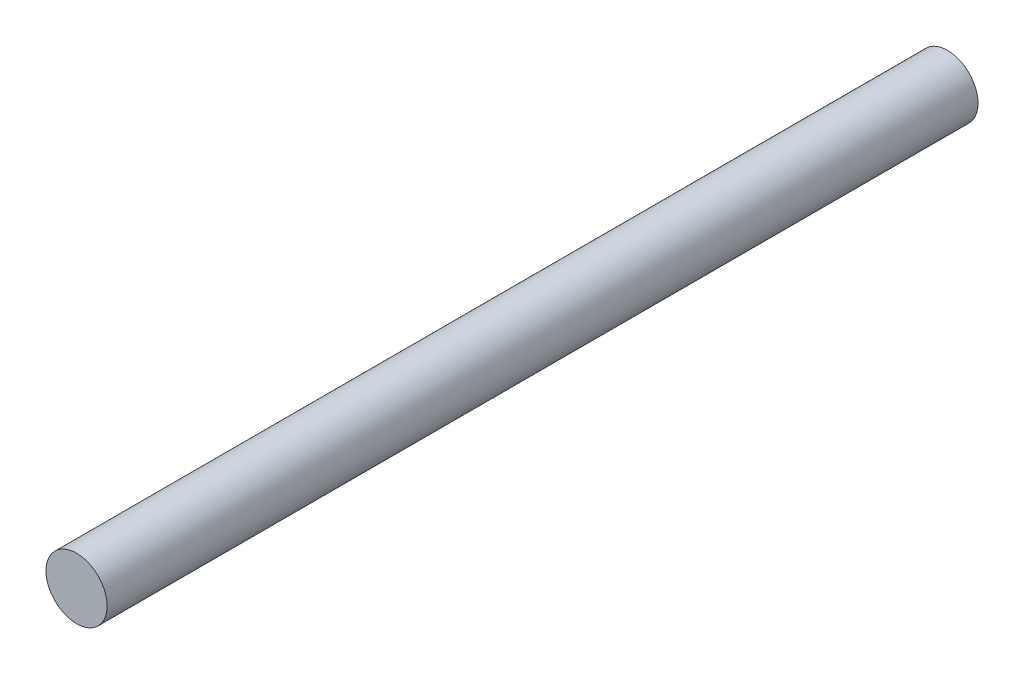
ISO-10303-21;
HEADER;
FILE_DESCRIPTION(('STEP AP214'),'2;1');
FILE_NAME('part.step','',(''),(''),'','','');
FILE_SCHEMA(('AUTOMOTIVE_DESIGN { 1 0 10303 214 1 1 1 1 }'));
ENDSEC;
DATA;
#1=APPLICATION_CONTEXT('core data for automotive mechanical design processes');
#2=APPLICATION_PROTOCOL_DEFINITION('international standard','automotive_design',2000,#1);
#3=PRODUCT_CONTEXT('',#1,'mechanical');
#4=PRODUCT('Part','Part','',(#3));
#5=PRODUCT_RELATED_PRODUCT_CATEGORY('part','',(#4));
#6=PRODUCT_DEFINITION_FORMATION('','',#4);
#7=PRODUCT_DEFINITION_CONTEXT('part definition',#1,'design');
#8=PRODUCT_DEFINITION('design','',#6,#7);
#9=PRODUCT_DEFINITION_SHAPE('','',#8);
#10=(LENGTH_UNIT() NAMED_UNIT(*) SI_UNIT(.MILLI.,.METRE.));
#11=(NAMED_UNIT(*) PLANE_ANGLE_UNIT() SI_UNIT($,.RADIAN.));
#12=(NAMED_UNIT(*) SI_UNIT($,.STERADIAN.) SOLID_ANGLE_UNIT());
#13=UNCERTAINTY_MEASURE_WITH_UNIT(LENGTH_MEASURE(1.E-05),#10,'distance_accuracy_value','');
#14=(GEOMETRIC_REPRESENTATION_CONTEXT(3) GLOBAL_UNCERTAINTY_ASSIGNED_CONTEXT((#13)) GLOBAL_UNIT_ASSIGNED_CONTEXT((#10,
#11,#12)) REPRESENTATION_CONTEXT('',''));
#15=CARTESIAN_POINT('',(0.,0.,0.));
#16=DIRECTION('',(0.,0.,1.));
#17=DIRECTION('',(1.,0.,0.));
#18=AXIS2_PLACEMENT_3D('',#15,#16,#17);
#19=CARTESIAN_POINT('',(0.,0.,114.));
#20=DIRECTION('',(0.,0.,-1.));
#21=DIRECTION('',(-1.,0.,0.));
#22=AXIS2_PLACEMENT_3D('',#19,#20,#21);
#23=CYLINDRICAL_SURFACE('',#22,4.);
#24=CARTESIAN_POINT('',(0.,0.,114.));
#25=DIRECTION('',(0.,0.,1.));
#26=DIRECTION('',(1.,0.,0.));
#27=AXIS2_PLACEMENT_3D('',#24,#25,#26);
#28=CIRCLE('',#27,4.);
#29=CARTESIAN_POINT('',(-4.,0.,114.));
#30=VERTEX_POINT('',#29);
#31=EDGE_CURVE('E10',#30,#30,#28,.T.);
#32=CARTESIAN_POINT('',(0.,0.,0.));
#33=DIRECTION('',(0.,0.,1.));
#34=DIRECTION('',(1.,0.,0.));
#35=AXIS2_PLACEMENT_3D('',#32,#33,#34);
#36=CIRCLE('',#35,4.);
#37=CARTESIAN_POINT('',(-4.,0.,0.));
#38=VERTEX_POINT('',#37);
#39=EDGE_CURVE('E33',#38,#38,#36,.T.);
#40=CARTESIAN_POINT('',(-4.,0.,114.));
#41=CARTESIAN_POINT('',(-4.,0.,112.8125));
#42=CARTESIAN_POINT('',(-4.,0.,111.625));
#43=CARTESIAN_POINT('',(-4.,0.,109.25));
#44=CARTESIAN_POINT('',(-4.,0.,108.0625));
#45=CARTESIAN_POINT('',(-4.,0.,105.6875));
#46=CARTESIAN_POINT('',(-4.,0.,104.5));
#47=CARTESIAN_POINT('',(-4.,0.,102.125));
#48=CARTESIAN_POINT('',(-4.,0.,100.9375));
#49=CARTESIAN_POINT('',(-4.,0.,98.5625));
#50=CARTESIAN_POINT('',(-4.,0.,97.375));
#51=CARTESIAN_POINT('',(-4.,0.,95.));
#52=CARTESIAN_POINT('',(-4.,0.,93.8125));
#53=CARTESIAN_POINT('',(-4.,0.,91.4375));
#54=CARTESIAN_POINT('',(-4.,0.,90.25));
#55=CARTESIAN_POINT('',(-4.,0.,87.875));
#56=CARTESIAN_POINT('',(-4.,0.,86.6875));
#57=CARTESIAN_POINT('',(-4.,0.,84.3125));
#58=CARTESIAN_POINT('',(-4.,0.,83.125));
#59=CARTESIAN_POINT('',(-4.,0.,80.75));
#60=CARTESIAN_POINT('',(-4.,0.,79.5625));
#61=CARTESIAN_POINT('',(-4.,0.,77.1875));
#62=CARTESIAN_POINT('',(-4.,0.,76.));
#63=CARTESIAN_POINT('',(-4.,0.,73.625));
#64=CARTESIAN_POINT('',(-4.,0.,72.4375));
#65=CARTESIAN_POINT('',(-4.,0.,70.0625));
#66=CARTESIAN_POINT('',(-4.,0.,68.875));
#67=CARTESIAN_POINT('',(-4.,0.,66.5));
#68=CARTESIAN_POINT('',(-4.,0.,65.3125));
#69=CARTESIAN_POINT('',(-4.,0.,62.9375));
#70=CARTESIAN_POINT('',(-4.,0.,61.75));
#71=CARTESIAN_POINT('',(-4.,0.,59.375));
#72=CARTESIAN_POINT('',(-4.,0.,58.1875));
#73=CARTESIAN_POINT('',(-4.,0.,55.8125));
#74=CARTESIAN_POINT('',(-4.,0.,54.625));
#75=CARTESIAN_POINT('',(-4.,0.,52.25));
#76=CARTESIAN_POINT('',(-4.,0.,51.0625));
#77=CARTESIAN_POINT('',(-4.,0.,48.6875));
#78=CARTESIAN_POINT('',(-4.,0.,47.5));
#79=CARTESIAN_POINT('',(-4.,0.,45.125));
#80=CARTESIAN_POINT('',(-4.,0.,43.9375));
#81=CARTESIAN_POINT('',(-4.,0.,41.5625));
#82=CARTESIAN_POINT('',(-4.,0.,40.375));
#83=CARTESIAN_POINT('',(-4.,0.,38.));
#84=CARTESIAN_POINT('',(-4.,0.,36.8125));
#85=CARTESIAN_POINT('',(-4.,0.,34.4375));
#86=CARTESIAN_POINT('',(-4.,0.,33.25));
#87=CARTESIAN_POINT('',(-4.,0.,30.875));
#88=CARTESIAN_POINT('',(-4.,0.,29.6875));
#89=CARTESIAN_POINT('',(-4.,0.,27.3125));
#90=CARTESIAN_POINT('',(-4.,0.,26.125));
#91=CARTESIAN_POINT('',(-4.,0.,23.75));
#92=CARTESIAN_POINT('',(-4.,0.,22.5625));
#93=CARTESIAN_POINT('',(-4.,0.,20.1875));
#94=CARTESIAN_POINT('',(-4.,0.,19.));
#95=CARTESIAN_POINT('',(-4.,0.,16.625));
#96=CARTESIAN_POINT('',(-4.,0.,15.4375));
#97=CARTESIAN_POINT('',(-4.,0.,13.0625));
#98=CARTESIAN_POINT('',(-4.,0.,11.875));
#99=CARTESIAN_POINT('',(-4.,0.,9.5));
#100=CARTESIAN_POINT('',(-4.,0.,8.31250000000001));
#101=CARTESIAN_POINT('',(-4.,0.,5.9375));
#102=CARTESIAN_POINT('',(-4.,0.,4.75));
#103=CARTESIAN_POINT('',(-4.,0.,2.375));
#104=CARTESIAN_POINT('',(-4.,0.,1.1875));
#105=CARTESIAN_POINT('',(-4.,0.,0.));
#106=B_SPLINE_CURVE_WITH_KNOTS('',3,(#40,#41,#42,#43,#44,#45,#46,#47,#48,#49,#50,#51,#52,#53,
#54,#55,#56,#57,#58,#59,#60,#61,#62,#63,#64,#65,#66,#67,#68,#69,#70,#71,#72,#73,#74,#75,#76,#77,
#78,#79,#80,#81,#82,#83,#84,#85,#86,#87,#88,#89,#90,#91,#92,#93,#94,#95,#96,#97,#98,#99,#100,
#101,#102,#103,#104,#105),.UNSPECIFIED.,.F.,.F.,(4,2,2,2,2,2,2,2,2,2,2,2,2,2,2,2,2,2,2,2,2,2,2,
2,2,2,2,2,2,2,2,2,4),(0.,3.5625,7.12499999999999,10.6875,14.25,17.8125,21.375,24.9375,28.5,
32.0625,35.625,39.1875,42.75,46.3125,49.875,53.4375,57.,60.5625,64.125,67.6875,71.25,74.8125,
78.375,81.9375,85.5,89.0625,92.625,96.1875,99.75,103.3125,106.875,110.4375,114.),.UNSPECIFIED.);
#107=EDGE_CURVE('BSEAM30',#30,#38,#106,.T.);
#108=ORIENTED_EDGE('',*,*,#31,.F.);
#109=ORIENTED_EDGE('',*,*,#39,.T.);
#110=ORIENTED_EDGE('',*,*,#107,.T.);
#111=ORIENTED_EDGE('',*,*,#107,.F.);
#112=EDGE_LOOP('',(#108,#110,#109,#111));
#113=FACE_BOUND('',#112,.T.);
#114=ADVANCED_FACE('F30',(#113),#23,.T.);
#115=CARTESIAN_POINT('',(0.,0.,114.));
#116=DIRECTION('',(0.,0.,1.));
#117=DIRECTION('',(1.,0.,0.));
#118=AXIS2_PLACEMENT_3D('',#115,#116,#117);
#119=PLANE('',#118);
#120=ORIENTED_EDGE('',*,*,#31,.T.);
#121=EDGE_LOOP('',(#120));
#122=FACE_BOUND('',#121,.T.);
#123=ADVANCED_FACE('F45',(#122),#119,.T.);
#124=CARTESIAN_POINT('',(0.,0.,0.));
#125=DIRECTION('',(0.,0.,1.));
#126=DIRECTION('',(1.,0.,0.));
#127=AXIS2_PLACEMENT_3D('',#124,#125,#126);
#128=PLANE('',#127);
#129=ORIENTED_EDGE('',*,*,#39,.F.);
#130=EDGE_LOOP('',(#129));
#131=FACE_BOUND('',#130,.T.);
#132=ADVANCED_FACE('F43',(#131),#128,.F.);
#133=CLOSED_SHELL('',(#114,#123,#132));
#134=MANIFOLD_SOLID_BREP('B2',#133);
#135=ADVANCED_BREP_SHAPE_REPRESENTATION('',(#18,#134),#14);
#136=SHAPE_DEFINITION_REPRESENTATION(#9,#135);
ENDSEC;
END-ISO-10303-21;
